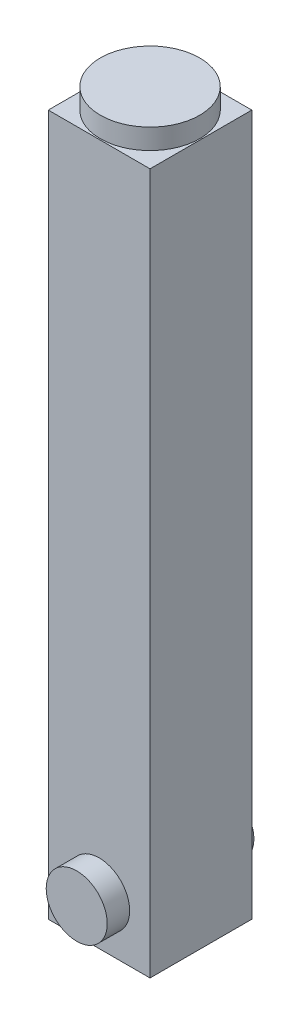
ISO-10303-21;
HEADER;
FILE_DESCRIPTION(('STEP AP214'),'2;1');
FILE_NAME('part.step','',(''),(''),'','','');
FILE_SCHEMA(('AUTOMOTIVE_DESIGN { 1 0 10303 214 1 1 1 1 }'));
ENDSEC;
DATA;
#1=APPLICATION_CONTEXT('core data for automotive mechanical design processes');
#2=APPLICATION_PROTOCOL_DEFINITION('international standard','automotive_design',2000,#1);
#3=PRODUCT_CONTEXT('',#1,'mechanical');
#4=PRODUCT('Part','Part','',(#3));
#5=PRODUCT_RELATED_PRODUCT_CATEGORY('part','',(#4));
#6=PRODUCT_DEFINITION_FORMATION('','',#4);
#7=PRODUCT_DEFINITION_CONTEXT('part definition',#1,'design');
#8=PRODUCT_DEFINITION('design','',#6,#7);
#9=PRODUCT_DEFINITION_SHAPE('','',#8);
#10=(LENGTH_UNIT() NAMED_UNIT(*) SI_UNIT(.MILLI.,.METRE.));
#11=(NAMED_UNIT(*) PLANE_ANGLE_UNIT() SI_UNIT($,.RADIAN.));
#12=(NAMED_UNIT(*) SI_UNIT($,.STERADIAN.) SOLID_ANGLE_UNIT());
#13=UNCERTAINTY_MEASURE_WITH_UNIT(LENGTH_MEASURE(1.E-05),#10,'distance_accuracy_value','');
#14=(GEOMETRIC_REPRESENTATION_CONTEXT(3) GLOBAL_UNCERTAINTY_ASSIGNED_CONTEXT((#13)) GLOBAL_UNIT_ASSIGNED_CONTEXT((#10,
#11,#12)) REPRESENTATION_CONTEXT('',''));
#15=CARTESIAN_POINT('',(0.,0.,0.));
#16=DIRECTION('',(0.,0.,1.));
#17=DIRECTION('',(1.,0.,0.));
#18=AXIS2_PLACEMENT_3D('',#15,#16,#17);
#19=CARTESIAN_POINT('',(31.75,-225.,63.5));
#20=DIRECTION('',(-1.,0.,0.));
#21=DIRECTION('',(0.,0.,1.));
#22=AXIS2_PLACEMENT_3D('',#19,#20,#21);
#23=PLANE('',#22);
#24=DIRECTION('',(0.,0.,-1.));
#25=VECTOR('',#24,1.);
#26=CARTESIAN_POINT('',(31.75,212.3,0.));
#27=LINE('',#26,#25);
#28=CARTESIAN_POINT('',(31.75,212.3,63.5));
#29=VERTEX_POINT('',#28);
#30=CARTESIAN_POINT('',(31.75,212.3,0.));
#31=VERTEX_POINT('',#30);
#32=EDGE_CURVE('E47',#29,#31,#27,.T.);
#33=ORIENTED_EDGE('',*,*,#32,.F.);
#34=DIRECTION('',(0.,1.,0.));
#35=VECTOR('',#34,1.);
#36=CARTESIAN_POINT('',(31.75,-225.,63.5));
#37=LINE('',#36,#35);
#38=CARTESIAN_POINT('',(31.75,-225.,63.5));
#39=VERTEX_POINT('',#38);
#40=EDGE_CURVE('E78',#39,#29,#37,.T.);
#41=ORIENTED_EDGE('',*,*,#40,.F.);
#42=DIRECTION('',(0.,0.,-1.));
#43=VECTOR('',#42,1.);
#44=CARTESIAN_POINT('',(31.75,-225.,63.5));
#45=LINE('',#44,#43);
#46=CARTESIAN_POINT('',(31.75,-225.,0.));
#47=VERTEX_POINT('',#46);
#48=EDGE_CURVE('E72',#39,#47,#45,.T.);
#49=ORIENTED_EDGE('',*,*,#48,.T.);
#50=DIRECTION('',(0.,1.,0.));
#51=VECTOR('',#50,1.);
#52=CARTESIAN_POINT('',(31.75,-225.,0.));
#53=LINE('',#52,#51);
#54=EDGE_CURVE('E83',#47,#31,#53,.T.);
#55=ORIENTED_EDGE('',*,*,#54,.T.);
#56=EDGE_LOOP('',(#33,#41,#49,#55));
#57=FACE_BOUND('',#56,.T.);
#58=ADVANCED_FACE('F33',(#57),#23,.F.);
#59=CARTESIAN_POINT('',(-31.75,-225.,63.5));
#60=DIRECTION('',(1.,0.,0.));
#61=DIRECTION('',(0.,0.,-1.));
#62=AXIS2_PLACEMENT_3D('',#59,#60,#61);
#63=PLANE('',#62);
#64=DIRECTION('',(0.,0.,1.));
#65=VECTOR('',#64,1.);
#66=CARTESIAN_POINT('',(-31.75,212.3,0.));
#67=LINE('',#66,#65);
#68=CARTESIAN_POINT('',(-31.75,212.3,0.));
#69=VERTEX_POINT('',#68);
#70=CARTESIAN_POINT('',(-31.75,212.3,63.5));
#71=VERTEX_POINT('',#70);
#72=EDGE_CURVE('E105',#69,#71,#67,.T.);
#73=ORIENTED_EDGE('',*,*,#72,.F.);
#74=DIRECTION('',(0.,-1.,0.));
#75=VECTOR('',#74,1.);
#76=CARTESIAN_POINT('',(-31.75,-225.,0.));
#77=LINE('',#76,#75);
#78=CARTESIAN_POINT('',(-31.75,-225.,0.));
#79=VERTEX_POINT('',#78);
#80=EDGE_CURVE('E79',#69,#79,#77,.T.);
#81=ORIENTED_EDGE('',*,*,#80,.T.);
#82=DIRECTION('',(0.,0.,-1.));
#83=VECTOR('',#82,1.);
#84=CARTESIAN_POINT('',(-31.75,-225.,63.5));
#85=LINE('',#84,#83);
#86=CARTESIAN_POINT('',(-31.75,-225.,63.5));
#87=VERTEX_POINT('',#86);
#88=EDGE_CURVE('E40',#87,#79,#85,.T.);
#89=ORIENTED_EDGE('',*,*,#88,.F.);
#90=DIRECTION('',(0.,-1.,0.));
#91=VECTOR('',#90,1.);
#92=CARTESIAN_POINT('',(-31.75,-225.,63.5));
#93=LINE('',#92,#91);
#94=EDGE_CURVE('E95',#71,#87,#93,.T.);
#95=ORIENTED_EDGE('',*,*,#94,.F.);
#96=EDGE_LOOP('',(#73,#81,#89,#95));
#97=FACE_BOUND('',#96,.T.);
#98=ADVANCED_FACE('F135',(#97),#63,.F.);
#99=CARTESIAN_POINT('',(0.,0.,63.5));
#100=DIRECTION('',(0.,0.,-1.));
#101=DIRECTION('',(-1.,0.,0.));
#102=AXIS2_PLACEMENT_3D('',#99,#100,#101);
#103=PLANE('',#102);
#104=CARTESIAN_POINT('',(0.,-195.,63.5));
#105=DIRECTION('',(0.,0.,-1.));
#106=DIRECTION('',(-1.,0.,0.));
#107=AXIS2_PLACEMENT_3D('',#104,#105,#106);
#108=CIRCLE('',#107,19.05);
#109=CARTESIAN_POINT('',(-19.05,-195.,63.5));
#110=VERTEX_POINT('',#109);
#111=EDGE_CURVE('E11',#110,#110,#108,.F.);
#112=ORIENTED_EDGE('',*,*,#111,.F.);
#113=EDGE_LOOP('',(#112));
#114=FACE_BOUND('',#113,.T.);
#115=DIRECTION('',(1.,0.,0.));
#116=VECTOR('',#115,1.);
#117=CARTESIAN_POINT('',(-31.75,212.3,63.5));
#118=LINE('',#117,#116);
#119=EDGE_CURVE('E101',#71,#29,#118,.T.);
#120=ORIENTED_EDGE('',*,*,#119,.F.);
#121=ORIENTED_EDGE('',*,*,#94,.T.);
#122=DIRECTION('',(1.,0.,0.));
#123=VECTOR('',#122,1.);
#124=CARTESIAN_POINT('',(-31.75,-225.,63.5));
#125=LINE('',#124,#123);
#126=EDGE_CURVE('E56',#87,#39,#125,.T.);
#127=ORIENTED_EDGE('',*,*,#126,.T.);
#128=ORIENTED_EDGE('',*,*,#40,.T.);
#129=EDGE_LOOP('',(#120,#121,#127,#128));
#130=FACE_BOUND('',#129,.T.);
#131=ADVANCED_FACE('F140',(#114,#130),#103,.F.);
#132=CARTESIAN_POINT('',(0.,0.,0.));
#133=DIRECTION('',(0.,0.,-1.));
#134=DIRECTION('',(-1.,0.,0.));
#135=AXIS2_PLACEMENT_3D('',#132,#133,#134);
#136=PLANE('',#135);
#137=CARTESIAN_POINT('',(0.,-195.,0.));
#138=DIRECTION('',(0.,0.,-1.));
#139=DIRECTION('',(-1.,0.,0.));
#140=AXIS2_PLACEMENT_3D('',#137,#138,#139);
#141=CIRCLE('',#140,19.05);
#142=CARTESIAN_POINT('',(-19.05,-195.,0.));
#143=VERTEX_POINT('',#142);
#144=EDGE_CURVE('E98',#143,#143,#141,.T.);
#145=ORIENTED_EDGE('',*,*,#144,.F.);
#146=EDGE_LOOP('',(#145));
#147=FACE_BOUND('',#146,.T.);
#148=ORIENTED_EDGE('',*,*,#80,.F.);
#149=DIRECTION('',(-1.,0.,0.));
#150=VECTOR('',#149,1.);
#151=CARTESIAN_POINT('',(-31.75,212.3,0.));
#152=LINE('',#151,#150);
#153=EDGE_CURVE('E86',#31,#69,#152,.T.);
#154=ORIENTED_EDGE('',*,*,#153,.F.);
#155=ORIENTED_EDGE('',*,*,#54,.F.);
#156=DIRECTION('',(1.,0.,0.));
#157=VECTOR('',#156,1.);
#158=CARTESIAN_POINT('',(-31.75,-225.,0.));
#159=LINE('',#158,#157);
#160=EDGE_CURVE('E69',#79,#47,#159,.T.);
#161=ORIENTED_EDGE('',*,*,#160,.F.);
#162=EDGE_LOOP('',(#148,#154,#155,#161));
#163=FACE_BOUND('',#162,.T.);
#164=ADVANCED_FACE('F85',(#147,#163),#136,.T.);
#165=CARTESIAN_POINT('',(-31.75,-225.,63.5));
#166=DIRECTION('',(0.,1.,0.));
#167=DIRECTION('',(0.,0.,1.));
#168=AXIS2_PLACEMENT_3D('',#165,#166,#167);
#169=PLANE('',#168);
#170=ORIENTED_EDGE('',*,*,#160,.T.);
#171=ORIENTED_EDGE('',*,*,#48,.F.);
#172=ORIENTED_EDGE('',*,*,#126,.F.);
#173=ORIENTED_EDGE('',*,*,#88,.T.);
#174=EDGE_LOOP('',(#170,#171,#172,#173));
#175=FACE_BOUND('',#174,.T.);
#176=ADVANCED_FACE('F71',(#175),#169,.F.);
#177=CARTESIAN_POINT('',(0.,-195.,77.5));
#178=DIRECTION('',(0.,0.,-1.));
#179=DIRECTION('',(-1.,0.,0.));
#180=AXIS2_PLACEMENT_3D('',#177,#178,#179);
#181=CYLINDRICAL_SURFACE('',#180,19.05);
#182=CARTESIAN_POINT('',(0.,-195.,77.5));
#183=DIRECTION('',(0.,0.,1.));
#184=DIRECTION('',(1.,0.,0.));
#185=AXIS2_PLACEMENT_3D('',#182,#183,#184);
#186=CIRCLE('',#185,19.05);
#187=CARTESIAN_POINT('',(19.05,-195.,77.5));
#188=VERTEX_POINT('',#187);
#189=EDGE_CURVE('E87',#188,#188,#186,.T.);
#190=ORIENTED_EDGE('',*,*,#189,.F.);
#191=EDGE_LOOP('',(#190));
#192=FACE_BOUND('',#191,.T.);
#193=ORIENTED_EDGE('',*,*,#111,.T.);
#194=EDGE_LOOP('',(#193));
#195=FACE_BOUND('',#194,.T.);
#196=ADVANCED_FACE('F206',(#192,#195),#181,.T.);
#197=CARTESIAN_POINT('',(0.,-195.,77.5));
#198=DIRECTION('',(0.,0.,1.));
#199=DIRECTION('',(1.,0.,0.));
#200=AXIS2_PLACEMENT_3D('',#197,#198,#199);
#201=PLANE('',#200);
#202=ORIENTED_EDGE('',*,*,#189,.T.);
#203=EDGE_LOOP('',(#202));
#204=FACE_BOUND('',#203,.T.);
#205=ADVANCED_FACE('F198',(#204),#201,.T.);
#206=CARTESIAN_POINT('',(0.,-195.,-14.));
#207=DIRECTION('',(0.,0.,1.));
#208=DIRECTION('',(1.,0.,0.));
#209=AXIS2_PLACEMENT_3D('',#206,#207,#208);
#210=CYLINDRICAL_SURFACE('',#209,19.05);
#211=CARTESIAN_POINT('',(0.,-195.,-14.));
#212=DIRECTION('',(0.,0.,-1.));
#213=DIRECTION('',(-1.,0.,0.));
#214=AXIS2_PLACEMENT_3D('',#211,#212,#213);
#215=CIRCLE('',#214,19.05);
#216=CARTESIAN_POINT('',(-19.05,-195.,-14.));
#217=VERTEX_POINT('',#216);
#218=EDGE_CURVE('E91',#217,#217,#215,.T.);
#219=ORIENTED_EDGE('',*,*,#218,.F.);
#220=EDGE_LOOP('',(#219));
#221=FACE_BOUND('',#220,.T.);
#222=ORIENTED_EDGE('',*,*,#144,.T.);
#223=EDGE_LOOP('',(#222));
#224=FACE_BOUND('',#223,.T.);
#225=ADVANCED_FACE('F131',(#221,#224),#210,.T.);
#226=CARTESIAN_POINT('',(0.,-195.,-14.));
#227=DIRECTION('',(0.,0.,-1.));
#228=DIRECTION('',(-1.,0.,0.));
#229=AXIS2_PLACEMENT_3D('',#226,#227,#228);
#230=PLANE('',#229);
#231=ORIENTED_EDGE('',*,*,#218,.T.);
#232=EDGE_LOOP('',(#231));
#233=FACE_BOUND('',#232,.T.);
#234=ADVANCED_FACE('F122',(#233),#230,.T.);
#235=CARTESIAN_POINT('',(0.,212.3,0.));
#236=DIRECTION('',(0.,1.,0.));
#237=DIRECTION('',(0.,0.,1.));
#238=AXIS2_PLACEMENT_3D('',#235,#236,#237);
#239=PLANE('',#238);
#240=CARTESIAN_POINT('',(0.,212.3,31.75));
#241=DIRECTION('',(0.,1.,0.));
#242=DIRECTION('',(0.,0.,1.));
#243=AXIS2_PLACEMENT_3D('',#240,#241,#242);
#244=CIRCLE('',#243,31.);
#245=CARTESIAN_POINT('',(0.,212.3,62.75));
#246=VERTEX_POINT('',#245);
#247=EDGE_CURVE('E110',#246,#246,#244,.T.);
#248=ORIENTED_EDGE('',*,*,#247,.F.);
#249=EDGE_LOOP('',(#248));
#250=FACE_BOUND('',#249,.T.);
#251=ORIENTED_EDGE('',*,*,#32,.T.);
#252=ORIENTED_EDGE('',*,*,#153,.T.);
#253=ORIENTED_EDGE('',*,*,#72,.T.);
#254=ORIENTED_EDGE('',*,*,#119,.T.);
#255=EDGE_LOOP('',(#251,#252,#253,#254));
#256=FACE_BOUND('',#255,.T.);
#257=ADVANCED_FACE('F120',(#250,#256),#239,.T.);
#258=CARTESIAN_POINT('',(0.,212.3,31.75));
#259=DIRECTION('',(0.,1.,0.));
#260=DIRECTION('',(0.,0.,1.));
#261=AXIS2_PLACEMENT_3D('',#258,#259,#260);
#262=CYLINDRICAL_SURFACE('',#261,31.);
#263=ORIENTED_EDGE('',*,*,#247,.T.);
#264=EDGE_LOOP('',(#263));
#265=FACE_BOUND('',#264,.T.);
#266=CARTESIAN_POINT('',(0.,225.,31.75));
#267=DIRECTION('',(0.,1.,0.));
#268=DIRECTION('',(0.,0.,1.));
#269=AXIS2_PLACEMENT_3D('',#266,#267,#268);
#270=CIRCLE('',#269,31.);
#271=CARTESIAN_POINT('',(0.,225.,62.75));
#272=VERTEX_POINT('',#271);
#273=EDGE_CURVE('E111',#272,#272,#270,.T.);
#274=ORIENTED_EDGE('',*,*,#273,.F.);
#275=EDGE_LOOP('',(#274));
#276=FACE_BOUND('',#275,.T.);
#277=ADVANCED_FACE('F117',(#265,#276),#262,.T.);
#278=CARTESIAN_POINT('',(-31.75,225.,63.5));
#279=DIRECTION('',(0.,-1.,0.));
#280=DIRECTION('',(0.,0.,-1.));
#281=AXIS2_PLACEMENT_3D('',#278,#279,#280);
#282=PLANE('',#281);
#283=ORIENTED_EDGE('',*,*,#273,.T.);
#284=EDGE_LOOP('',(#283));
#285=FACE_BOUND('',#284,.T.);
#286=ADVANCED_FACE('F128',(#285),#282,.F.);
#287=CLOSED_SHELL('',(#58,#98,#131,#164,#176,#196,#205,#225,#234,#257,#277,#286));
#288=MANIFOLD_SOLID_BREP('B2',#287);
#289=ADVANCED_BREP_SHAPE_REPRESENTATION('',(#18,#288),#14);
#290=SHAPE_DEFINITION_REPRESENTATION(#9,#289);
ENDSEC;
END-ISO-10303-21;
